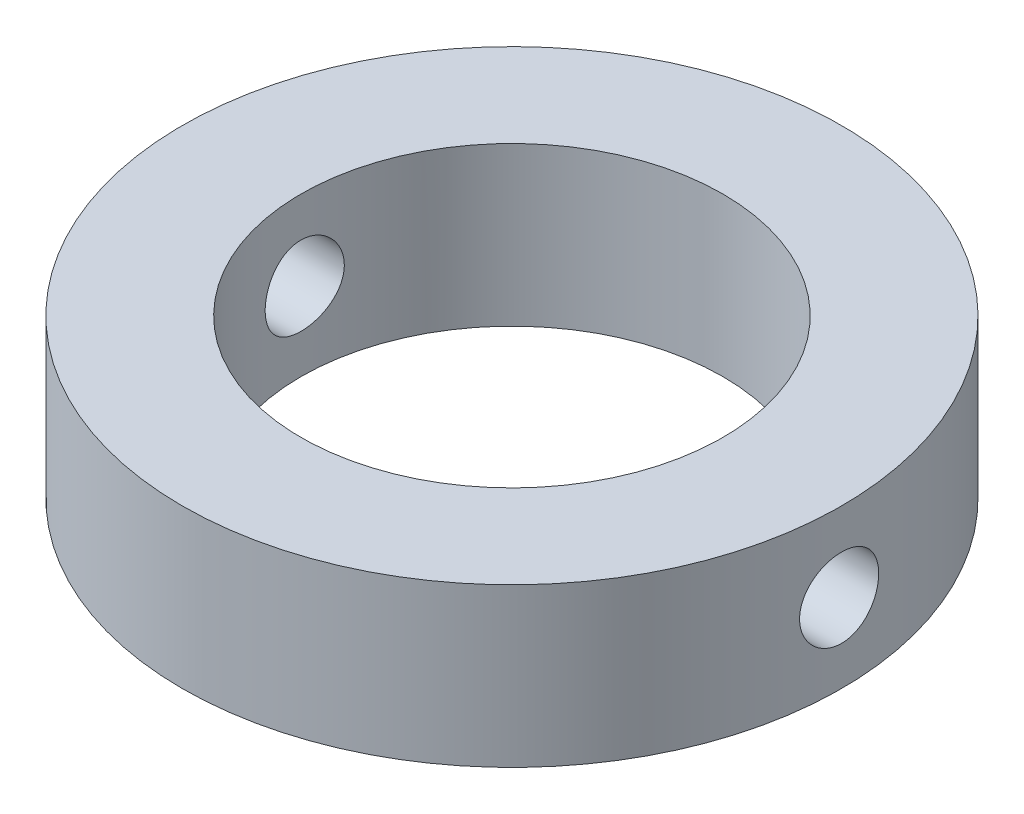
ISO-10303-21;
HEADER;
FILE_DESCRIPTION(('STEP AP214'),'2;1');
FILE_NAME('part.step','',(''),(''),'','','');
FILE_SCHEMA(('AUTOMOTIVE_DESIGN { 1 0 10303 214 1 1 1 1 }'));
ENDSEC;
DATA;
#1=APPLICATION_CONTEXT('core data for automotive mechanical design processes');
#2=APPLICATION_PROTOCOL_DEFINITION('international standard','automotive_design',2000,#1);
#3=PRODUCT_CONTEXT('',#1,'mechanical');
#4=PRODUCT('Part','Part','',(#3));
#5=PRODUCT_RELATED_PRODUCT_CATEGORY('part','',(#4));
#6=PRODUCT_DEFINITION_FORMATION('','',#4);
#7=PRODUCT_DEFINITION_CONTEXT('part definition',#1,'design');
#8=PRODUCT_DEFINITION('design','',#6,#7);
#9=PRODUCT_DEFINITION_SHAPE('','',#8);
#10=(LENGTH_UNIT() NAMED_UNIT(*) SI_UNIT(.MILLI.,.METRE.));
#11=(NAMED_UNIT(*) PLANE_ANGLE_UNIT() SI_UNIT($,.RADIAN.));
#12=(NAMED_UNIT(*) SI_UNIT($,.STERADIAN.) SOLID_ANGLE_UNIT());
#13=UNCERTAINTY_MEASURE_WITH_UNIT(LENGTH_MEASURE(1.E-05),#10,'distance_accuracy_value','');
#14=(GEOMETRIC_REPRESENTATION_CONTEXT(3) GLOBAL_UNCERTAINTY_ASSIGNED_CONTEXT((#13)) GLOBAL_UNIT_ASSIGNED_CONTEXT((#10,
#11,#12)) REPRESENTATION_CONTEXT('',''));
#15=CARTESIAN_POINT('',(0.,0.,0.));
#16=DIRECTION('',(0.,0.,1.));
#17=DIRECTION('',(1.,0.,0.));
#18=AXIS2_PLACEMENT_3D('',#15,#16,#17);
#19=CARTESIAN_POINT('',(-25.,5.97286953808693,0.));
#20=DIRECTION('',(1.,0.,0.));
#21=DIRECTION('',(0.,0.,-1.));
#22=AXIS2_PLACEMENT_3D('',#19,#20,#21);
#23=CYLINDRICAL_SURFACE('',#22,3.);
#24=CARTESIAN_POINT('',(-15.7162336455017,5.97286953808693,-3.));
#25=CARTESIAN_POINT('',(-15.7162368759014,6.13978395411217,-2.99999359766589));
#26=CARTESIAN_POINT('',(-15.7189215952138,6.30678143452418,-2.98602252697898));
#27=CARTESIAN_POINT('',(-15.7293570202788,6.63606746125027,-2.93054506503584));
#28=CARTESIAN_POINT('',(-15.7371120234618,6.79835189094176,-2.88901531536947));
#29=CARTESIAN_POINT('',(-15.7567795293,7.1133996808288,-2.77974071235582));
#30=CARTESIAN_POINT('',(-15.7686881581205,7.26617175670154,-2.7120202790875));
#31=CARTESIAN_POINT('',(-15.7953165264186,7.55817665666052,-2.5523513152073));
#32=CARTESIAN_POINT('',(-15.8100360465123,7.69741053609352,-2.46040467518386));
#33=CARTESIAN_POINT('',(-15.8408322967791,7.9601299364852,-2.25367357885245));
#34=CARTESIAN_POINT('',(-15.8569223325136,8.08342250503039,-2.13864585866183));
#35=CARTESIAN_POINT('',(-15.8885291532806,8.30907831728605,-1.8895435576071));
#36=CARTESIAN_POINT('',(-15.904045900623,8.41144018693652,-1.75546772724989));
#37=CARTESIAN_POINT('',(-15.9329003565681,8.59306829128796,-1.47080778914032));
#38=CARTESIAN_POINT('',(-15.9462205610473,8.67215260512577,-1.32010568006773));
#39=CARTESIAN_POINT('',(-15.9690321726586,8.80380862263399,-1.00726256650152));
#40=CARTESIAN_POINT('',(-15.9785238945667,8.85638250606737,-0.84512250371901));
#41=CARTESIAN_POINT('',(-15.9925151024756,8.9329286353092,-0.516005492374831));
#42=CARTESIAN_POINT('',(-15.9970713195265,8.9572261499323,-0.349106646489713));
#43=CARTESIAN_POINT('',(-16.0008736923119,8.97754331348773,-0.0135433520707647));
#44=CARTESIAN_POINT('',(-16.0001203002139,8.97356537036504,0.155120944895342));
#45=CARTESIAN_POINT('',(-15.9934326752648,8.93769399579262,0.487196715798795));
#46=CARTESIAN_POINT('',(-15.9875634449443,8.90615079922691,0.65064752090294));
#47=CARTESIAN_POINT('',(-15.9713765266712,8.81659823929645,0.969894331430953));
#48=CARTESIAN_POINT('',(-15.9610586765993,8.75858791139532,1.12569005765308));
#49=CARTESIAN_POINT('',(-15.9370252059468,8.61741407597033,1.42622013150304));
#50=CARTESIAN_POINT('',(-15.9232907518165,8.53411056226193,1.57088714367707));
#51=CARTESIAN_POINT('',(-15.893942950857,8.34481819993262,1.84431995442928));
#52=CARTESIAN_POINT('',(-15.8783294130233,8.23882704431177,1.97308413382157));
#53=CARTESIAN_POINT('',(-15.8466702736113,8.00523813211987,2.21313123793808));
#54=CARTESIAN_POINT('',(-15.8306217180324,7.87733397028278,2.32411581514082));
#55=CARTESIAN_POINT('',(-15.8001301784924,7.60457047552968,2.52310343702521));
#56=CARTESIAN_POINT('',(-15.785687218027,7.45971089455766,2.61110614542364));
#57=CARTESIAN_POINT('',(-15.7600378661424,7.1567529966816,2.76171704448955));
#58=CARTESIAN_POINT('',(-15.7488370106052,6.99863262370564,2.82428187290843));
#59=CARTESIAN_POINT('',(-15.7310248479338,6.67386716984052,2.92187313950112));
#60=CARTESIAN_POINT('',(-15.7244130207724,6.50722305715736,2.95690269802216));
#61=CARTESIAN_POINT('',(-15.7166304060201,6.17283088037517,2.99799345299478));
#62=CARTESIAN_POINT('',(-15.7153791163227,6.0051373069559,3.00448328571717));
#63=CARTESIAN_POINT('',(-15.7182438284168,5.67106262791263,2.98945937763449));
#64=CARTESIAN_POINT('',(-15.7223595647722,5.50468145779076,2.96794702172866));
#65=CARTESIAN_POINT('',(-15.7354196012641,5.17936373197815,2.89789736391765));
#66=CARTESIAN_POINT('',(-15.7443237338176,5.02037703283714,2.84958477167979));
#67=CARTESIAN_POINT('',(-15.7659226831324,4.71275515862661,2.7275444875812));
#68=CARTESIAN_POINT('',(-15.7786177792656,4.56412074745627,2.6538149225759));
#69=CARTESIAN_POINT('',(-15.8065515572737,4.27953430000059,2.4820470623932));
#70=CARTESIAN_POINT('',(-15.8218179085063,4.14374846235478,2.38373799279242));
#71=CARTESIAN_POINT('',(-15.853096227362,3.89044545765826,2.16596688688493));
#72=CARTESIAN_POINT('',(-15.8691082619299,3.77292993497538,2.04650294866167));
#73=CARTESIAN_POINT('',(-15.9003324801189,3.55790201101868,1.78789883574077));
#74=CARTESIAN_POINT('',(-15.9155311166661,3.460677884875,1.64851706819178));
#75=CARTESIAN_POINT('',(-15.943188096207,3.2910271257316,1.35514904608028));
#76=CARTESIAN_POINT('',(-15.9556465446945,3.21859953803692,1.20116335407706));
#77=CARTESIAN_POINT('',(-15.9763611599169,3.10102934235877,0.883755083157368));
#78=CARTESIAN_POINT('',(-15.9846390946028,3.05574516296411,0.720386426157977));
#79=CARTESIAN_POINT('',(-15.9961528416749,2.99329544150716,0.388192454763139));
#80=CARTESIAN_POINT('',(-15.9993891845988,2.97612694076152,0.219367716431695));
#81=CARTESIAN_POINT('',(-16.0004445503087,2.97049893505003,-0.116181520501013));
#82=CARTESIAN_POINT('',(-15.9983457325,2.98160403182783,-0.282898614132515));
#83=CARTESIAN_POINT('',(-15.9891373322347,3.03125439362384,-0.612046738558422));
#84=CARTESIAN_POINT('',(-15.9820277978157,3.0697993955755,-0.774477810427463));
#85=CARTESIAN_POINT('',(-15.9635967595586,3.17305195285421,-1.09021295119089));
#86=CARTESIAN_POINT('',(-15.9522827196229,3.23771316384836,-1.24353263863614));
#87=CARTESIAN_POINT('',(-15.9266674413841,3.39131044539787,-1.5372112626337));
#88=CARTESIAN_POINT('',(-15.912366002962,3.48024814230239,-1.67756933000769));
#89=CARTESIAN_POINT('',(-15.882095597166,3.68137244696939,-1.94351005555884));
#90=CARTESIAN_POINT('',(-15.8661056917023,3.79387360580214,-2.06885247077667));
#91=CARTESIAN_POINT('',(-15.8343926708998,4.03827866308055,-2.2990307213141));
#92=CARTESIAN_POINT('',(-15.8186696191953,4.17018711886501,-2.40386172651201));
#93=CARTESIAN_POINT('',(-15.7891115480538,4.45112244746706,-2.59095267889405));
#94=CARTESIAN_POINT('',(-15.7752953438736,4.60029641731552,-2.67299481058047));
#95=CARTESIAN_POINT('',(-15.7513416912985,4.91052111793902,-2.81072264841151));
#96=CARTESIAN_POINT('',(-15.7412007725928,5.07156047123765,-2.86643323276462));
#97=CARTESIAN_POINT('',(-15.7278603261272,5.35637411423466,-2.9385945319323));
#98=CARTESIAN_POINT('',(-15.7235262144357,5.47848098561512,-2.96158211479939));
#99=CARTESIAN_POINT('',(-15.7177117118331,5.72466647492326,-2.99228702152192));
#100=CARTESIAN_POINT('',(-15.7162312432422,5.84874503908627,-3.00000476104182));
#101=CARTESIAN_POINT('',(-15.7162336455017,5.97286953808693,-3.));
#102=B_SPLINE_CURVE_WITH_KNOTS('',3,(#24,#25,#26,#27,#28,#29,#30,#31,#32,#33,#34,#35,#36,#37,
#38,#39,#40,#41,#42,#43,#44,#45,#46,#47,#48,#49,#50,#51,#52,#53,#54,#55,#56,#57,#58,#59,#60,#61,
#62,#63,#64,#65,#66,#67,#68,#69,#70,#71,#72,#73,#74,#75,#76,#77,#78,#79,#80,#81,#82,#83,#84,#85,
#86,#87,#88,#89,#90,#91,#92,#93,#94,#95,#96,#97,#98,#99,#100,#101),.UNSPECIFIED.,.T.,.F.,(4,2,2,
2,2,2,2,2,2,2,2,2,2,2,2,2,2,2,2,2,2,2,2,2,2,2,2,2,2,2,2,2,2,2,2,2,2,2,4),(0.,0.500289011586374,
1.00100260476079,1.50125045595686,2.00145927987816,2.50724671397382,3.0130673413863,
3.52274208696095,4.03237491879281,4.53608550920522,5.03975320401296,5.53711301197449,
6.03449094656849,6.53467383968438,7.03490761823571,7.54281229528129,8.050724403848,
8.55949872236533,9.06821537732975,9.5692649717415,10.0702897867744,10.5671758463074,
11.0640985324863,11.5667572530829,12.0694611878935,12.5788825099174,13.0882842164341,
13.5950053883737,14.1016732333466,14.6005860114028,15.0994940064433,15.5975205306072,
16.0955804271422,16.6007692801749,17.1060769546153,17.6160600363782,18.1255603150176,
18.4976061505795,18.8696418584437),.UNSPECIFIED.);
#103=CARTESIAN_POINT('',(-15.7162336455017,5.97286953808693,-3.));
#104=VERTEX_POINT('',#103);
#105=EDGE_CURVE('E42',#104,#104,#102,.T.);
#106=ORIENTED_EDGE('',*,*,#105,.T.);
#107=EDGE_LOOP('',(#106));
#108=FACE_BOUND('',#107,.T.);
#109=CARTESIAN_POINT('',(-25.,2.97286953808693,0.));
#110=CARTESIAN_POINT('',(-24.9999977357459,2.97287670202836,-0.167864047107699));
#111=CARTESIAN_POINT('',(-24.9982914200408,2.98700619677961,-0.335834317331191));
#112=CARTESIAN_POINT('',(-24.991648705422,3.04315060224231,-0.66710457130825));
#113=CARTESIAN_POINT('',(-24.9867088933728,3.08519497933751,-0.830399429590069));
#114=CARTESIAN_POINT('',(-24.9741559265426,3.19591581461294,-1.14747479534053));
#115=CARTESIAN_POINT('',(-24.9665445315309,3.26457474491111,-1.30126148759225));
#116=CARTESIAN_POINT('',(-24.9494959264345,3.42653827317023,-1.595099157832));
#117=CARTESIAN_POINT('',(-24.9400590404141,3.51983849784024,-1.73515256713516));
#118=CARTESIAN_POINT('',(-24.920360105442,3.72894440006217,-1.99829131534451));
#119=CARTESIAN_POINT('',(-24.9100945030904,3.84485037819885,-2.1212966913072));
#120=CARTESIAN_POINT('',(-24.8899239397152,4.09566250297483,-2.34615931038342));
#121=CARTESIAN_POINT('',(-24.8800189967068,4.23056959710558,-2.44801549826473));
#122=CARTESIAN_POINT('',(-24.8616560370405,4.51607036338531,-2.62798342873896));
#123=CARTESIAN_POINT('',(-24.8532025903971,4.66671126266706,-2.7060207567257));
#124=CARTESIAN_POINT('',(-24.8387461344686,4.97907824019567,-2.8356605730156));
#125=CARTESIAN_POINT('',(-24.8327430393798,5.14080393005623,-2.88726398696776));
#126=CARTESIAN_POINT('',(-24.8239006073737,5.46992239739835,-2.96232930045399));
#127=CARTESIAN_POINT('',(-24.8210461452543,5.63728406651461,-2.98592577987646));
#128=CARTESIAN_POINT('',(-24.8187777690611,5.97361447445109,-3.0047237521967));
#129=CARTESIAN_POINT('',(-24.8193637271033,6.1425831533039,-2.99992630052848));
#130=CARTESIAN_POINT('',(-24.8238961466306,6.47639550287128,-2.96218316078668));
#131=CARTESIAN_POINT('',(-24.8278249434675,6.64125617676711,-2.92938543222303));
#132=CARTESIAN_POINT('',(-24.8385728087608,6.96311656590829,-2.83680346170067));
#133=CARTESIAN_POINT('',(-24.8453919315688,7.12011613326592,-2.77701871225814));
#134=CARTESIAN_POINT('',(-24.8611722079476,7.42225900632604,-2.63199980699862));
#135=CARTESIAN_POINT('',(-24.8701387862198,7.56737101644048,-2.54670106203925));
#136=CARTESIAN_POINT('',(-24.8891993987901,7.84127674900269,-2.35312173169469));
#137=CARTESIAN_POINT('',(-24.8992934806213,7.9700697829895,-2.24484017723156));
#138=CARTESIAN_POINT('',(-24.9195503308637,8.20854062245131,-2.0075475556218));
#139=CARTESIAN_POINT('',(-24.929713127424,8.31809150794399,-1.87840890051216));
#140=CARTESIAN_POINT('',(-24.9489020798549,8.51398105908724,-1.60350795893872));
#141=CARTESIAN_POINT('',(-24.9579282334421,8.60031967810608,-1.45774563908004));
#142=CARTESIAN_POINT('',(-24.9738318861702,8.74733282372659,-1.15363930826284));
#143=CARTESIAN_POINT('',(-24.9807087472809,8.80799973141736,-0.995291578715589));
#144=CARTESIAN_POINT('',(-24.991533065309,8.90184827593783,-0.670556022273438));
#145=CARTESIAN_POINT('',(-24.9954806485584,8.93503109809141,-0.504168542441622));
#146=CARTESIAN_POINT('',(-24.9999852500304,8.97280579358462,-0.169174396374216));
#147=CARTESIAN_POINT('',(-25.0005630093753,8.97757257048763,-0.000587720432051688));
#148=CARTESIAN_POINT('',(-24.9983187823231,8.95884096021866,0.33498206824326));
#149=CARTESIAN_POINT('',(-24.9954968625308,8.93534312679157,0.501965212327329));
#150=CARTESIAN_POINT('',(-24.9867833380686,8.86089457408383,0.829074263928357));
#151=CARTESIAN_POINT('',(-24.9809010237909,8.81002692503684,0.989219346369035));
#152=CARTESIAN_POINT('',(-24.9667255501792,8.68236883473335,1.29870539768646));
#153=CARTESIAN_POINT('',(-24.9584323148759,8.60557757659684,1.44804602592347));
#154=CARTESIAN_POINT('',(-24.9403085158695,8.4278266221845,1.73246717766505));
#155=CARTESIAN_POINT('',(-24.9304708084643,8.32675340027611,1.86747628962751));
#156=CARTESIAN_POINT('',(-24.9103817919419,8.10346869167875,2.11867625152204));
#157=CARTESIAN_POINT('',(-24.9001304677484,7.98125643393897,2.23486641472949));
#158=CARTESIAN_POINT('',(-24.8803059484942,7.71839392265924,2.44574795226154));
#159=CARTESIAN_POINT('',(-24.8707365831307,7.57765052274308,2.54032363231939));
#160=CARTESIAN_POINT('',(-24.8534214993383,7.28217451301137,2.70449314429332));
#161=CARTESIAN_POINT('',(-24.8456757467943,7.12744216496868,2.77408744356074));
#162=CARTESIAN_POINT('',(-24.8329105734502,6.80875892919223,2.88612996668159));
#163=CARTESIAN_POINT('',(-24.8278845275633,6.64483152622754,2.92864420159346));
#164=CARTESIAN_POINT('',(-24.8211085274587,6.31210056860186,2.98553272163516));
#165=CARTESIAN_POINT('',(-24.8193584337106,6.1432972219296,2.99990820526081));
#166=CARTESIAN_POINT('',(-24.819336326607,5.80675680844975,3.00009033817931));
#167=CARTESIAN_POINT('',(-24.8210421863943,5.63901981231566,2.98607873671351));
#168=CARTESIAN_POINT('',(-24.8276922947425,5.30830275169276,2.93026848672089));
#169=CARTESIAN_POINT('',(-24.8326365444656,5.14532268891134,2.88846982822067));
#170=CARTESIAN_POINT('',(-24.8451996524586,4.82876499919823,2.77832739820545));
#171=CARTESIAN_POINT('',(-24.8528177016812,4.67518454459144,2.70999165570539));
#172=CARTESIAN_POINT('',(-24.8698714539139,4.38164179101683,2.5487328262801));
#173=CARTESIAN_POINT('',(-24.8793071726153,4.24167960962762,2.45580952709445));
#174=CARTESIAN_POINT('',(-24.8990055122588,3.97841659797809,2.24733689647205));
#175=CARTESIAN_POINT('',(-24.9092728581347,3.85522343482065,2.1316520393015));
#176=CARTESIAN_POINT('',(-24.9294354968169,3.62992705852092,1.88122093334447));
#177=CARTESIAN_POINT('',(-24.939330701051,3.52782884045774,1.74647018263601));
#178=CARTESIAN_POINT('',(-24.9576721709324,3.34731896008807,1.46119322465137));
#179=CARTESIAN_POINT('',(-24.966113221621,3.26899181236464,1.31061323462417));
#180=CARTESIAN_POINT('',(-24.9805418519727,3.13884577364435,0.99842275168531));
#181=CARTESIAN_POINT('',(-24.9865321180615,3.08699784190654,0.836824564362144));
#182=CARTESIAN_POINT('',(-24.9939268325999,3.02380611774881,0.561977101236697));
#183=CARTESIAN_POINT('',(-24.996193279433,3.00473205420055,0.450466569753487));
#184=CARTESIAN_POINT('',(-24.9992306204204,2.97926139459597,0.225986735693694));
#185=CARTESIAN_POINT('',(-25.0000015244492,2.97286471483648,0.113017442753625));
#186=CARTESIAN_POINT('',(-25.,2.97286953808693,0.));
#187=B_SPLINE_CURVE_WITH_KNOTS('',3,(#109,#110,#111,#112,#113,#114,#115,#116,#117,#118,#119,
#120,#121,#122,#123,#124,#125,#126,#127,#128,#129,#130,#131,#132,#133,#134,#135,#136,#137,#138,
#139,#140,#141,#142,#143,#144,#145,#146,#147,#148,#149,#150,#151,#152,#153,#154,#155,#156,#157,
#158,#159,#160,#161,#162,#163,#164,#165,#166,#167,#168,#169,#170,#171,#172,#173,#174,#175,#176,
#177,#178,#179,#180,#181,#182,#183,#184,#185,#186),.UNSPECIFIED.,.T.,.F.,(4,2,2,2,2,2,2,2,2,2,2,
2,2,2,2,2,2,2,2,2,2,2,2,2,2,2,2,2,2,2,2,2,2,2,2,2,2,2,4),(0.,0.503179350956159,1.00689069408623,
1.5102708637556,2.01356175441693,2.51913872195878,3.02474090904883,3.53190689496397,
4.03905511999114,4.54375638343279,5.0484388866848,5.55047092912253,6.05251241253396,
6.55583573710536,7.05918028869262,7.56572944640317,8.07227962172601,8.57898002694279,
9.08565857822619,9.58921522624226,10.0927620090108,10.5947890255775,11.0968318630167,
11.6012692178556,12.1057249760357,12.6128207581672,13.119907053063,13.6257524826489,
14.1315763666154,14.6341719319229,15.1367676776234,15.6392114771388,16.1416596143122,
16.6471952402032,17.1528504352009,17.6602829023946,18.1671576479275,18.5059342945627,
18.8447087043981),.UNSPECIFIED.);
#188=CARTESIAN_POINT('',(-25.,2.97286953808693,0.));
#189=VERTEX_POINT('',#188);
#190=EDGE_CURVE('E10',#189,#189,#187,.T.);
#191=ORIENTED_EDGE('',*,*,#190,.F.);
#192=EDGE_LOOP('',(#191));
#193=FACE_BOUND('',#192,.T.);
#194=ADVANCED_FACE('F37',(#108,#193),#23,.F.);
#195=CARTESIAN_POINT('',(0.,12.,0.));
#196=DIRECTION('',(0.,-1.,0.));
#197=DIRECTION('',(0.,0.,-1.));
#198=AXIS2_PLACEMENT_3D('',#195,#196,#197);
#199=CYLINDRICAL_SURFACE('',#198,25.);
#200=ORIENTED_EDGE('',*,*,#190,.T.);
#201=EDGE_LOOP('',(#200));
#202=FACE_BOUND('',#201,.T.);
#203=CARTESIAN_POINT('',(24.8193472919817,5.97286953808693,-3.));
#204=CARTESIAN_POINT('',(24.819349617552,5.80501039688706,-2.99999283172714));
#205=CARTESIAN_POINT('',(24.8210685774632,5.63704501793709,-2.98586413495824));
#206=CARTESIAN_POINT('',(24.8277564496116,5.30578492602905,-2.92972318709126));
#207=CARTESIAN_POINT('',(24.8327287982131,5.14249534240067,-2.88768145238964));
#208=CARTESIAN_POINT('',(24.8453523109071,4.8254311325824,-2.77696834616031));
#209=CARTESIAN_POINT('',(24.8530016988387,4.6716502769532,-2.708314627898));
#210=CARTESIAN_POINT('',(24.8701152498661,4.37782239598347,-2.5463633755789));
#211=CARTESIAN_POINT('',(24.8795790917656,4.2377729465183,-2.45307020212001));
#212=CARTESIAN_POINT('',(24.8993100054925,3.97462976647743,-2.24397143930053));
#213=CARTESIAN_POINT('',(24.9095805816582,3.85161724373851,-2.1280639725065));
#214=CARTESIAN_POINT('',(24.9297361585383,3.62674081992484,-1.87724586434875));
#215=CARTESIAN_POINT('',(24.9396211403948,3.52487795214508,-1.74233429505413));
#216=CARTESIAN_POINT('',(24.9579274023082,3.3449030051507,-1.45682956846799));
#217=CARTESIAN_POINT('',(24.9663441380671,3.2668641223473,-1.30618995384899));
#218=CARTESIAN_POINT('',(24.9807271243236,3.13722107770218,-0.993825767272774));
#219=CARTESIAN_POINT('',(24.9866934589465,3.0856160083392,-0.832101576085541));
#220=CARTESIAN_POINT('',(24.9954787324527,3.01054728198348,-0.502987856985083));
#221=CARTESIAN_POINT('',(24.9983127364408,2.98694888464116,-0.335629471043379));
#222=CARTESIAN_POINT('',(25.0005654366101,2.96814593877641,0.000694496668564813));
#223=CARTESIAN_POINT('',(24.9999842572034,2.97294035592871,0.169660019668339));
#224=CARTESIAN_POINT('',(24.9954842925266,3.01067865993829,0.503485667517529));
#225=CARTESIAN_POINT('',(24.9915826884338,3.04347764305932,0.668362437568212));
#226=CARTESIAN_POINT('',(24.9808996422381,3.13606768980293,0.990254370091176));
#227=CARTESIAN_POINT('',(24.9741181490466,3.19585923226858,1.1472693930426));
#228=CARTESIAN_POINT('',(24.9584077904554,3.34089226699345,1.44943112325938));
#229=CARTESIAN_POINT('',(24.9494736188692,3.42619677409335,1.59454729727538));
#230=CARTESIAN_POINT('',(24.9304580967161,3.61978843704308,1.86845892019878));
#231=CARTESIAN_POINT('',(24.9203766976596,3.72807656450254,1.99725367876689));
#232=CARTESIAN_POINT('',(24.9001206745296,3.96537388762739,2.23571721123049));
#233=CARTESIAN_POINT('',(24.8899458632542,4.09450931946043,2.34526038878379));
#234=CARTESIAN_POINT('',(24.8707126046075,4.36940105176643,2.54113591825157));
#235=CARTESIAN_POINT('',(24.8616541602595,4.51515739725141,2.62746820730526));
#236=CARTESIAN_POINT('',(24.8456792055215,4.81926202823431,2.77447678358649));
#237=CARTESIAN_POINT('',(24.8387634934567,4.97761497934484,2.83514351157641));
#238=CARTESIAN_POINT('',(24.8278728306612,5.30236189758811,2.92899010032377));
#239=CARTESIAN_POINT('',(24.8238977496732,5.46875550820623,2.96217117858551));
#240=CARTESIAN_POINT('',(24.8193620015637,5.80375263446361,2.99993928712165));
#241=CARTESIAN_POINT('',(24.8187802560634,5.97233597396806,3.00470284270772));
#242=CARTESIAN_POINT('',(24.8210413301146,6.30789831892986,2.98596598055603));
#243=CARTESIAN_POINT('',(24.82388408253,6.4748773557743,2.96246611691248));
#244=CARTESIAN_POINT('',(24.8326546274979,6.8019653216849,2.88801791942018));
#245=CARTESIAN_POINT('',(24.8385728602158,6.96209388489625,2.83715462498938));
#246=CARTESIAN_POINT('',(24.8528197853248,7.27154882106289,2.70951076792624));
#247=CARTESIAN_POINT('',(24.8611485560914,7.42087484258998,2.63272936258612));
#248=CARTESIAN_POINT('',(24.8793287313299,7.70528583306155,2.45499302721611));
#249=CARTESIAN_POINT('',(24.8891873609855,7.84029782496823,2.35392207141476));
#250=CARTESIAN_POINT('',(24.9092935540369,8.09150465109872,2.13064017836707));
#251=CARTESIAN_POINT('',(24.9195411313438,8.20769881149281,2.0084284844362));
#252=CARTESIAN_POINT('',(24.939335094491,8.41858928532185,1.74556427266772));
#253=CARTESIAN_POINT('',(24.9488775256031,8.51316978459835,1.60481849941783));
#254=CARTESIAN_POINT('',(24.966127243116,8.67734774741602,1.30933642941058));
#255=CARTESIAN_POINT('',(24.9738345640038,8.74694568046137,1.15460039564442));
#256=CARTESIAN_POINT('',(24.9865280430514,8.85899054296272,0.835919244719986));
#257=CARTESIAN_POINT('',(24.9915209702628,8.90150505797118,0.671998170647183));
#258=CARTESIAN_POINT('',(24.9982511364507,8.95839628166909,0.339280584991478));
#259=CARTESIAN_POINT('',(24.9999885101567,8.97277415478006,0.170484275461259));
#260=CARTESIAN_POINT('',(25.0000113048646,8.97296338219926,-0.166060006255657));
#261=CARTESIAN_POINT('',(24.9983183365244,8.95895357477016,-0.333807904658863));
#262=CARTESIAN_POINT('',(24.9917135402075,8.90314308318443,-0.664547224796243));
#263=CARTESIAN_POINT('',(24.9868017132859,8.86134240813734,-0.827538648089519));
#264=CARTESIAN_POINT('',(24.9743088019473,8.75119152295541,-1.14411955598358));
#265=CARTESIAN_POINT('',(24.9667285079088,8.68284917363269,-1.29771180874788));
#266=CARTESIAN_POINT('',(24.9497392443223,8.52157346850226,-1.59127541052543));
#267=CARTESIAN_POINT('',(24.9403302599753,8.4286399136831,-1.73124664929415));
#268=CARTESIAN_POINT('',(24.920663936203,8.22015585608164,-1.99450948424813));
#269=CARTESIAN_POINT('',(24.910401817522,8.1044721827648,-2.11769526787512));
#270=CARTESIAN_POINT('',(24.8902246865463,7.85404650093086,-2.34297730712577));
#271=CARTESIAN_POINT('',(24.88030975725,7.71929997357204,-2.44506854813714));
#272=CARTESIAN_POINT('',(24.8619119204259,7.4340266019279,-2.62557074728252));
#273=CARTESIAN_POINT('',(24.8534342444193,7.28344520986035,-2.70389598198192));
#274=CARTESIAN_POINT('',(24.8389322365013,6.97125178438288,-2.8340380582164));
#275=CARTESIAN_POINT('',(24.8329052161653,6.80965206690139,-2.88588396425552));
#276=CARTESIAN_POINT('',(24.8254627238532,6.53480999897535,-2.94907010073915));
#277=CARTESIAN_POINT('',(24.8231807309863,6.42330678612466,-2.96814164942006));
#278=CARTESIAN_POINT('',(24.8201222373143,6.19884160595506,-2.99360896909453));
#279=CARTESIAN_POINT('',(24.8193457263061,6.08587964852766,-3.00000482599459));
#280=CARTESIAN_POINT('',(24.8193472919817,5.97286953808693,-3.));
#281=B_SPLINE_CURVE_WITH_KNOTS('',3,(#203,#204,#205,#206,#207,#208,#209,#210,#211,#212,#213,
#214,#215,#216,#217,#218,#219,#220,#221,#222,#223,#224,#225,#226,#227,#228,#229,#230,#231,#232,
#233,#234,#235,#236,#237,#238,#239,#240,#241,#242,#243,#244,#245,#246,#247,#248,#249,#250,#251,
#252,#253,#254,#255,#256,#257,#258,#259,#260,#261,#262,#263,#264,#265,#266,#267,#268,#269,#270,
#271,#272,#273,#274,#275,#276,#277,#278,#279,#280),.UNSPECIFIED.,.T.,.F.,(4,2,2,2,2,2,2,2,2,2,2,
2,2,2,2,2,2,2,2,2,2,2,2,2,2,2,2,2,2,2,2,2,2,2,2,2,2,2,4),(0.,0.503164613232923,1.00686154966524,
1.51022492507114,2.01349927674882,2.51909553323416,3.02471648549883,3.53187561756201,
4.03901733675556,4.54370917218765,5.04838262225285,5.55046046161349,6.05254720809332,
6.55588445357933,7.05924298138499,7.56577244411506,8.07230327863779,8.57902260679249,
9.08571948810824,9.58926554088957,10.0928017219916,10.5947819896887,11.0967785804672,
11.6012225031328,12.105684484956,12.6127892929794,13.119884570345,13.6257094034364,
14.1315133027652,14.6341406188081,15.1367677700954,15.6392461723566,16.1417286411941,
16.6472450412647,17.1528814752089,17.6603206216507,18.1672015841626,18.5059562893408,
18.8447086986815),.UNSPECIFIED.);
#282=CARTESIAN_POINT('',(24.8193472919817,5.97286953808693,-3.));
#283=VERTEX_POINT('',#282);
#284=EDGE_CURVE('E51',#283,#283,#281,.T.);
#285=ORIENTED_EDGE('',*,*,#284,.T.);
#286=EDGE_LOOP('',(#285));
#287=FACE_BOUND('',#286,.T.);
#288=CARTESIAN_POINT('',(0.,12.,0.));
#289=DIRECTION('',(0.,1.,0.));
#290=DIRECTION('',(0.,0.,1.));
#291=AXIS2_PLACEMENT_3D('',#288,#289,#290);
#292=CIRCLE('',#291,25.);
#293=CARTESIAN_POINT('',(0.,12.,25.));
#294=VERTEX_POINT('',#293);
#295=EDGE_CURVE('E56',#294,#294,#292,.T.);
#296=ORIENTED_EDGE('',*,*,#295,.F.);
#297=EDGE_LOOP('',(#296));
#298=FACE_BOUND('',#297,.T.);
#299=CARTESIAN_POINT('',(0.,0.,0.));
#300=DIRECTION('',(0.,1.,0.));
#301=DIRECTION('',(0.,0.,1.));
#302=AXIS2_PLACEMENT_3D('',#299,#300,#301);
#303=CIRCLE('',#302,25.);
#304=CARTESIAN_POINT('',(0.,0.,25.));
#305=VERTEX_POINT('',#304);
#306=EDGE_CURVE('E99',#305,#305,#303,.T.);
#307=ORIENTED_EDGE('',*,*,#306,.T.);
#308=EDGE_LOOP('',(#307));
#309=FACE_BOUND('',#308,.T.);
#310=ADVANCED_FACE('F39',(#202,#287,#298,#309),#199,.T.);
#311=CARTESIAN_POINT('',(0.,12.,0.));
#312=DIRECTION('',(0.,1.,0.));
#313=DIRECTION('',(0.,0.,1.));
#314=AXIS2_PLACEMENT_3D('',#311,#312,#313);
#315=PLANE('',#314);
#316=CARTESIAN_POINT('',(0.,12.,0.));
#317=DIRECTION('',(0.,-1.,0.));
#318=DIRECTION('',(0.,0.,-1.));
#319=AXIS2_PLACEMENT_3D('',#316,#317,#318);
#320=CIRCLE('',#319,16.);
#321=CARTESIAN_POINT('',(0.,12.,-16.));
#322=VERTEX_POINT('',#321);
#323=EDGE_CURVE('E102',#322,#322,#320,.T.);
#324=ORIENTED_EDGE('',*,*,#323,.T.);
#325=EDGE_LOOP('',(#324));
#326=FACE_BOUND('',#325,.T.);
#327=ORIENTED_EDGE('',*,*,#295,.T.);
#328=EDGE_LOOP('',(#327));
#329=FACE_BOUND('',#328,.T.);
#330=ADVANCED_FACE('F77',(#326,#329),#315,.T.);
#331=CARTESIAN_POINT('',(0.,0.,0.));
#332=DIRECTION('',(0.,1.,0.));
#333=DIRECTION('',(0.,0.,1.));
#334=AXIS2_PLACEMENT_3D('',#331,#332,#333);
#335=PLANE('',#334);
#336=CARTESIAN_POINT('',(0.,0.,0.));
#337=DIRECTION('',(0.,1.,0.));
#338=DIRECTION('',(0.,0.,1.));
#339=AXIS2_PLACEMENT_3D('',#336,#337,#338);
#340=CIRCLE('',#339,16.);
#341=CARTESIAN_POINT('',(0.,0.,16.));
#342=VERTEX_POINT('',#341);
#343=EDGE_CURVE('E98',#342,#342,#340,.T.);
#344=ORIENTED_EDGE('',*,*,#343,.T.);
#345=EDGE_LOOP('',(#344));
#346=FACE_BOUND('',#345,.T.);
#347=ORIENTED_EDGE('',*,*,#306,.F.);
#348=EDGE_LOOP('',(#347));
#349=FACE_BOUND('',#348,.T.);
#350=ADVANCED_FACE('F74',(#346,#349),#335,.F.);
#351=CARTESIAN_POINT('',(15.7162336455017,5.97286953808693,-3.));
#352=CARTESIAN_POINT('',(15.7162368759014,5.80595512206169,-2.99999359766589));
#353=CARTESIAN_POINT('',(15.7189215952138,5.63895764164967,-2.98602252697898));
#354=CARTESIAN_POINT('',(15.7293570202788,5.30967161492358,-2.93054506503584));
#355=CARTESIAN_POINT('',(15.7371120234618,5.1473871852321,-2.88901531536947));
#356=CARTESIAN_POINT('',(15.7567795293,4.83233939534505,-2.77974071235582));
#357=CARTESIAN_POINT('',(15.7686881581205,4.67956731947232,-2.7120202790875));
#358=CARTESIAN_POINT('',(15.7953165264186,4.38756241951334,-2.5523513152073));
#359=CARTESIAN_POINT('',(15.8100360465123,4.24832854008033,-2.46040467518386));
#360=CARTESIAN_POINT('',(15.8408322967791,3.98560913968865,-2.25367357885245));
#361=CARTESIAN_POINT('',(15.8569223325136,3.86231657114346,-2.13864585866183));
#362=CARTESIAN_POINT('',(15.8885291532806,3.6366607588878,-1.8895435576071));
#363=CARTESIAN_POINT('',(15.904045900623,3.53429888923734,-1.75546772724989));
#364=CARTESIAN_POINT('',(15.9329003565681,3.35267078488589,-1.47080778914032));
#365=CARTESIAN_POINT('',(15.9462205610473,3.27358647104808,-1.32010568006773));
#366=CARTESIAN_POINT('',(15.9690321726586,3.14193045353986,-1.00726256650152));
#367=CARTESIAN_POINT('',(15.9785238945667,3.08935657010649,-0.84512250371901));
#368=CARTESIAN_POINT('',(15.9925151024756,3.01281044086466,-0.516005492374831));
#369=CARTESIAN_POINT('',(15.9970713195265,2.98851292624156,-0.349106646489713));
#370=CARTESIAN_POINT('',(16.0008736923119,2.96819576268613,-0.0135433520707648));
#371=CARTESIAN_POINT('',(16.0001203002139,2.97217370580881,0.155120944895342));
#372=CARTESIAN_POINT('',(15.9934326752648,3.00804508038123,0.487196715798794));
#373=CARTESIAN_POINT('',(15.9875634449443,3.03958827694695,0.65064752090294));
#374=CARTESIAN_POINT('',(15.9713765266712,3.1291408368774,0.969894331430952));
#375=CARTESIAN_POINT('',(15.9610586765993,3.18715116477854,1.12569005765308));
#376=CARTESIAN_POINT('',(15.9370252059468,3.32832500020353,1.42622013150304));
#377=CARTESIAN_POINT('',(15.9232907518165,3.41162851391192,1.57088714367707));
#378=CARTESIAN_POINT('',(15.893942950857,3.60092087624124,1.84431995442928));
#379=CARTESIAN_POINT('',(15.8783294130233,3.70691203186209,1.97308413382157));
#380=CARTESIAN_POINT('',(15.8466702736113,3.94050094405399,2.21313123793808));
#381=CARTESIAN_POINT('',(15.8306217180324,4.06840510589108,2.32411581514082));
#382=CARTESIAN_POINT('',(15.8001301784924,4.34116860064418,2.52310343702521));
#383=CARTESIAN_POINT('',(15.785687218027,4.4860281816162,2.61110614542364));
#384=CARTESIAN_POINT('',(15.7600378661424,4.78898607949225,2.76171704448955));
#385=CARTESIAN_POINT('',(15.7488370106052,4.94710645246822,2.82428187290843));
#386=CARTESIAN_POINT('',(15.7310248479338,5.27187190633333,2.92187313950112));
#387=CARTESIAN_POINT('',(15.7244130207724,5.4385160190165,2.95690269802216));
#388=CARTESIAN_POINT('',(15.7166304060201,5.77290819579869,2.99799345299478));
#389=CARTESIAN_POINT('',(15.7153791163227,5.94060176921796,3.00448328571717));
#390=CARTESIAN_POINT('',(15.7182438284168,6.27467644826122,2.98945937763449));
#391=CARTESIAN_POINT('',(15.7223595647722,6.44105761838309,2.96794702172866));
#392=CARTESIAN_POINT('',(15.7354196012641,6.7663753441957,2.89789736391765));
#393=CARTESIAN_POINT('',(15.7443237338176,6.92536204333672,2.84958477167979));
#394=CARTESIAN_POINT('',(15.7659226831324,7.23298391754724,2.7275444875812));
#395=CARTESIAN_POINT('',(15.7786177792656,7.38161832871759,2.6538149225759));
#396=CARTESIAN_POINT('',(15.8065515572737,7.66620477617326,2.4820470623932));
#397=CARTESIAN_POINT('',(15.8218179085063,7.80199061381907,2.38373799279242));
#398=CARTESIAN_POINT('',(15.853096227362,8.05529361851559,2.16596688688493));
#399=CARTESIAN_POINT('',(15.8691082619299,8.17280914119848,2.04650294866167));
#400=CARTESIAN_POINT('',(15.9003324801189,8.38783706515518,1.78789883574077));
#401=CARTESIAN_POINT('',(15.9155311166661,8.48506119129886,1.64851706819178));
#402=CARTESIAN_POINT('',(15.943188096207,8.65471195044226,1.35514904608028));
#403=CARTESIAN_POINT('',(15.9556465446945,8.72713953813694,1.20116335407706));
#404=CARTESIAN_POINT('',(15.9763611599169,8.84470973381509,0.883755083157369));
#405=CARTESIAN_POINT('',(15.9846390946028,8.88999391320975,0.720386426157978));
#406=CARTESIAN_POINT('',(15.9961528416749,8.9524436346667,0.38819245476314));
#407=CARTESIAN_POINT('',(15.9993891845988,8.96961213541234,0.219367716431696));
#408=CARTESIAN_POINT('',(16.0004445503087,8.97524014112382,-0.116181520501012));
#409=CARTESIAN_POINT('',(15.9983457325,8.96413504434602,-0.282898614132514));
#410=CARTESIAN_POINT('',(15.9891373322347,8.91448468255001,-0.612046738558421));
#411=CARTESIAN_POINT('',(15.9820277978158,8.87593968059835,-0.774477810427462));
#412=CARTESIAN_POINT('',(15.9635967595586,8.77268712331965,-1.09021295119089));
#413=CARTESIAN_POINT('',(15.9522827196229,8.70802591232549,-1.24353263863614));
#414=CARTESIAN_POINT('',(15.9266674413841,8.55442863077599,-1.5372112626337));
#415=CARTESIAN_POINT('',(15.912366002962,8.46549093387147,-1.67756933000769));
#416=CARTESIAN_POINT('',(15.882095597166,8.26436662920447,-1.94351005555884));
#417=CARTESIAN_POINT('',(15.8661056917023,8.15186547037172,-2.06885247077667));
#418=CARTESIAN_POINT('',(15.8343926708998,7.90746041309331,-2.29903072131409));
#419=CARTESIAN_POINT('',(15.8186696191953,7.77555195730885,-2.403861726512));
#420=CARTESIAN_POINT('',(15.7891115480538,7.4946166287068,-2.59095267889405));
#421=CARTESIAN_POINT('',(15.7752953438736,7.34544265885834,-2.67299481058047));
#422=CARTESIAN_POINT('',(15.7513416912985,7.03521795823484,-2.81072264841151));
#423=CARTESIAN_POINT('',(15.7412007725928,6.8741786049362,-2.86643323276462));
#424=CARTESIAN_POINT('',(15.7278603261272,6.5893649619392,-2.9385945319323));
#425=CARTESIAN_POINT('',(15.7235262144357,6.46725809055873,-2.96158211479939));
#426=CARTESIAN_POINT('',(15.7177117118331,6.2210726012506,-2.99228702152192));
#427=CARTESIAN_POINT('',(15.7162312432422,6.09699403708758,-3.00000476104182));
#428=CARTESIAN_POINT('',(15.7162336455017,5.97286953808693,-3.));
#429=B_SPLINE_CURVE_WITH_KNOTS('',3,(#351,#352,#353,#354,#355,#356,#357,#358,#359,#360,#361,
#362,#363,#364,#365,#366,#367,#368,#369,#370,#371,#372,#373,#374,#375,#376,#377,#378,#379,#380,
#381,#382,#383,#384,#385,#386,#387,#388,#389,#390,#391,#392,#393,#394,#395,#396,#397,#398,#399,
#400,#401,#402,#403,#404,#405,#406,#407,#408,#409,#410,#411,#412,#413,#414,#415,#416,#417,#418,
#419,#420,#421,#422,#423,#424,#425,#426,#427,#428),.UNSPECIFIED.,.T.,.F.,(4,2,2,2,2,2,2,2,2,2,2,
2,2,2,2,2,2,2,2,2,2,2,2,2,2,2,2,2,2,2,2,2,2,2,2,2,2,2,4),(0.,0.500289011586374,1.00100260476079,
1.50125045595687,2.00145927987816,2.50724671397382,3.0130673413863,3.52274208696095,
4.03237491879281,4.53608550920522,5.03975320401296,5.53711301197449,6.03449094656849,
6.53467383968438,7.03490761823571,7.54281229528129,8.050724403848,8.55949872236533,
9.06821537732975,9.5692649717415,10.0702897867744,10.5671758463074,11.0640985324863,
11.5667572530829,12.0694611878935,12.5788825099174,13.0882842164341,13.5950053883737,
14.1016732333466,14.6005860114028,15.0994940064433,15.5975205306072,16.0955804271422,
16.6007692801749,17.1060769546153,17.6160600363781,18.1255603150176,18.4976061505795,
18.8696418584437),.UNSPECIFIED.);
#430=CARTESIAN_POINT('',(15.7162336455017,5.97286953808693,-3.));
#431=VERTEX_POINT('',#430);
#432=EDGE_CURVE('E65',#431,#431,#429,.T.);
#433=ORIENTED_EDGE('',*,*,#432,.T.);
#434=EDGE_LOOP('',(#433));
#435=FACE_BOUND('',#434,.T.);
#436=ORIENTED_EDGE('',*,*,#284,.F.);
#437=EDGE_LOOP('',(#436));
#438=FACE_BOUND('',#437,.T.);
#439=ADVANCED_FACE('F69',(#435,#438),#23,.F.);
#440=CARTESIAN_POINT('',(0.,12.,0.));
#441=DIRECTION('',(0.,-1.,0.));
#442=DIRECTION('',(0.,0.,-1.));
#443=AXIS2_PLACEMENT_3D('',#440,#441,#442);
#444=CYLINDRICAL_SURFACE('',#443,16.);
#445=ORIENTED_EDGE('',*,*,#105,.F.);
#446=EDGE_LOOP('',(#445));
#447=FACE_BOUND('',#446,.T.);
#448=ORIENTED_EDGE('',*,*,#323,.F.);
#449=EDGE_LOOP('',(#448));
#450=FACE_BOUND('',#449,.T.);
#451=ORIENTED_EDGE('',*,*,#432,.F.);
#452=EDGE_LOOP('',(#451));
#453=FACE_BOUND('',#452,.T.);
#454=ORIENTED_EDGE('',*,*,#343,.F.);
#455=EDGE_LOOP('',(#454));
#456=FACE_BOUND('',#455,.T.);
#457=ADVANCED_FACE('F73',(#447,#450,#453,#456),#444,.F.);
#458=CLOSED_SHELL('',(#194,#310,#330,#350,#439,#457));
#459=MANIFOLD_SOLID_BREP('B2',#458);
#460=ADVANCED_BREP_SHAPE_REPRESENTATION('',(#18,#459),#14);
#461=SHAPE_DEFINITION_REPRESENTATION(#9,#460);
ENDSEC;
END-ISO-10303-21;
